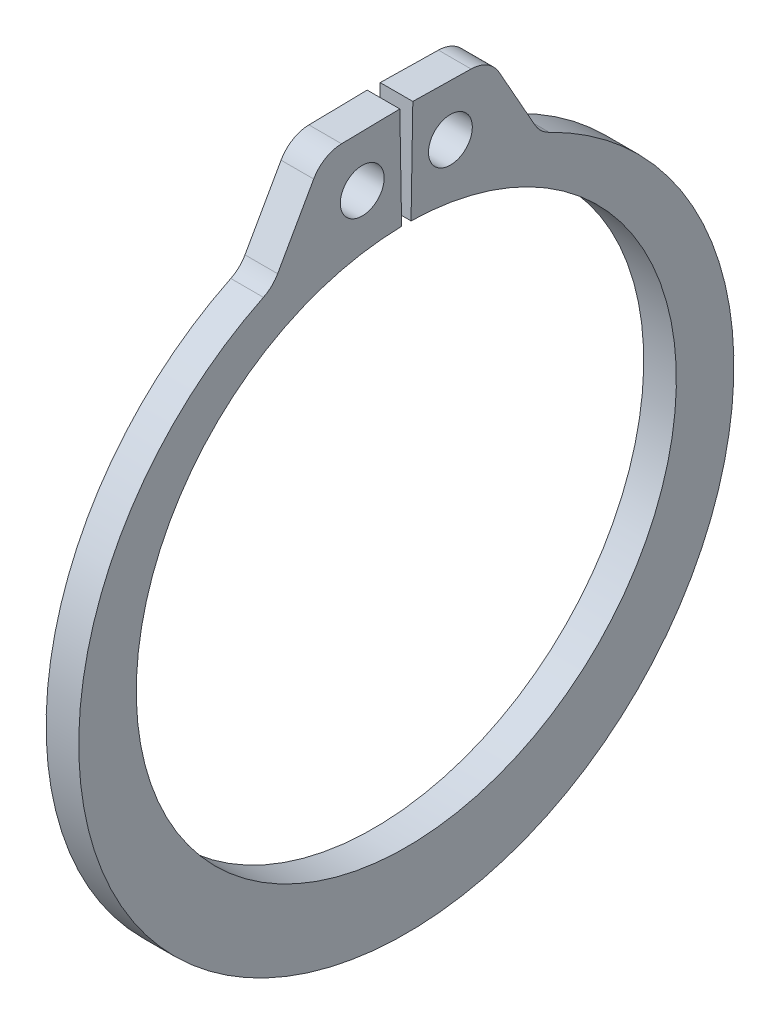
ISO-10303-21;
HEADER;
FILE_DESCRIPTION(('STEP AP214'),'2;1');
FILE_NAME('part.step','',(''),(''),'','','');
FILE_SCHEMA(('AUTOMOTIVE_DESIGN { 1 0 10303 214 1 1 1 1 }'));
ENDSEC;
DATA;
#1=APPLICATION_CONTEXT('core data for automotive mechanical design processes');
#2=APPLICATION_PROTOCOL_DEFINITION('international standard','automotive_design',2000,#1);
#3=PRODUCT_CONTEXT('',#1,'mechanical');
#4=PRODUCT('Part','Part','',(#3));
#5=PRODUCT_RELATED_PRODUCT_CATEGORY('part','',(#4));
#6=PRODUCT_DEFINITION_FORMATION('','',#4);
#7=PRODUCT_DEFINITION_CONTEXT('part definition',#1,'design');
#8=PRODUCT_DEFINITION('design','',#6,#7);
#9=PRODUCT_DEFINITION_SHAPE('','',#8);
#10=(LENGTH_UNIT() NAMED_UNIT(*) SI_UNIT(.MILLI.,.METRE.));
#11=(NAMED_UNIT(*) PLANE_ANGLE_UNIT() SI_UNIT($,.RADIAN.));
#12=(NAMED_UNIT(*) SI_UNIT($,.STERADIAN.) SOLID_ANGLE_UNIT());
#13=UNCERTAINTY_MEASURE_WITH_UNIT(LENGTH_MEASURE(1.E-05),#10,'distance_accuracy_value','');
#14=(GEOMETRIC_REPRESENTATION_CONTEXT(3) GLOBAL_UNCERTAINTY_ASSIGNED_CONTEXT((#13)) GLOBAL_UNIT_ASSIGNED_CONTEXT((#10,
#11,#12)) REPRESENTATION_CONTEXT('',''));
#15=CARTESIAN_POINT('',(0.,0.,0.));
#16=DIRECTION('',(0.,0.,1.));
#17=DIRECTION('',(1.,0.,0.));
#18=AXIS2_PLACEMENT_3D('',#15,#16,#17);
#19=CARTESIAN_POINT('',(0.4445,0.,0.));
#20=DIRECTION('',(1.,0.,0.));
#21=DIRECTION('',(0.,0.,-1.));
#22=AXIS2_PLACEMENT_3D('',#19,#20,#21);
#23=PLANE('',#22);
#24=CARTESIAN_POINT('',(0.4445,8.7306815280823,1.20030421464827));
#25=DIRECTION('',(1.,0.,0.));
#26=DIRECTION('',(0.,0.,-1.));
#27=AXIS2_PLACEMENT_3D('',#24,#25,#26);
#28=CIRCLE('',#27,0.5969);
#29=CARTESIAN_POINT('',(0.4445,8.7306815280823,0.603404214648272));
#30=VERTEX_POINT('',#29);
#31=EDGE_CURVE('E221',#30,#30,#28,.T.);
#32=ORIENTED_EDGE('',*,*,#31,.F.);
#33=EDGE_LOOP('',(#32));
#34=FACE_BOUND('',#33,.T.);
#35=DIRECTION('',(0.,-0.0174524064372845,0.999847695156391));
#36=VECTOR('',#35,1.);
#37=CARTESIAN_POINT('',(0.4445,10.1457545170604,0.177094803841047));
#38=LINE('',#37,#36);
#39=CARTESIAN_POINT('',(0.4445,10.1457545170604,0.177094803841047));
#40=VERTEX_POINT('',#39);
#41=CARTESIAN_POINT('',(0.4445,10.1180676789492,1.7632726969091));
#42=VERTEX_POINT('',#41);
#43=EDGE_CURVE('E133',#40,#42,#38,.T.);
#44=ORIENTED_EDGE('',*,*,#43,.T.);
#45=CARTESIAN_POINT('',(0.4445,9.22920307795521,1.74775750758636));
#46=DIRECTION('',(1.,0.,0.));
#47=DIRECTION('',(0.,0.,-1.));
#48=AXIS2_PLACEMENT_3D('',#45,#46,#47);
#49=CIRCLE('',#48,0.889);
#50=CARTESIAN_POINT('',(0.4445,9.66568817142324,2.52222620493971));
#51=VERTEX_POINT('',#50);
#52=EDGE_CURVE('E174',#42,#51,#49,.T.);
#53=ORIENTED_EDGE('',*,*,#52,.T.);
#54=DIRECTION('',(0.,-0.871168388473966,0.490984357106898));
#55=VECTOR('',#54,1.);
#56=CARTESIAN_POINT('',(0.4445,10.1091829993711,2.27227564904126));
#57=LINE('',#56,#55);
#58=CARTESIAN_POINT('',(0.4445,7.92368765824687,3.50400540326441));
#59=VERTEX_POINT('',#58);
#60=EDGE_CURVE('E213',#51,#59,#57,.T.);
#61=ORIENTED_EDGE('',*,*,#60,.T.);
#62=CARTESIAN_POINT('',(0.4445,8.3601727517149,4.27847410061776));
#63=DIRECTION('',(1.,0.,0.));
#64=DIRECTION('',(0.,0.,-1.));
#65=AXIS2_PLACEMENT_3D('',#62,#63,#64);
#66=CIRCLE('',#65,0.889);
#67=CARTESIAN_POINT('',(0.4445,7.5602084300375,3.8906879687832));
#68=VERTEX_POINT('',#67);
#69=EDGE_CURVE('E181',#59,#68,#66,.F.);
#70=ORIENTED_EDGE('',*,*,#69,.T.);
#71=CARTESIAN_POINT('',(0.4445,-0.465894894188214,0.));
#72=DIRECTION('',(1.,0.,0.));
#73=DIRECTION('',(0.,0.,-1.));
#74=AXIS2_PLACEMENT_3D('',#71,#72,#73);
#75=CIRCLE('',#74,8.91940510581179);
#76=CARTESIAN_POINT('',(0.4445,7.5602084300375,-3.8906879687832));
#77=VERTEX_POINT('',#76);
#78=EDGE_CURVE('E206',#68,#77,#75,.T.);
#79=ORIENTED_EDGE('',*,*,#78,.T.);
#80=CARTESIAN_POINT('',(0.4445,8.3601727517149,-4.27847410061776));
#81=DIRECTION('',(1.,0.,0.));
#82=DIRECTION('',(0.,0.,-1.));
#83=AXIS2_PLACEMENT_3D('',#80,#81,#82);
#84=CIRCLE('',#83,0.889);
#85=CARTESIAN_POINT('',(0.4445,7.92368765824687,-3.50400540326441));
#86=VERTEX_POINT('',#85);
#87=EDGE_CURVE('E11',#77,#86,#84,.F.);
#88=ORIENTED_EDGE('',*,*,#87,.T.);
#89=DIRECTION('',(0.,0.871168388473966,0.490984357106898));
#90=VECTOR('',#89,1.);
#91=CARTESIAN_POINT('',(0.4445,10.1091829993711,-2.27227564904126));
#92=LINE('',#91,#90);
#93=CARTESIAN_POINT('',(0.4445,9.66568817142324,-2.52222620493971));
#94=VERTEX_POINT('',#93);
#95=EDGE_CURVE('E205',#86,#94,#92,.T.);
#96=ORIENTED_EDGE('',*,*,#95,.T.);
#97=CARTESIAN_POINT('',(0.4445,9.22920307795521,-1.74775750758636));
#98=DIRECTION('',(1.,0.,0.));
#99=DIRECTION('',(0.,0.,-1.));
#100=AXIS2_PLACEMENT_3D('',#97,#98,#99);
#101=CIRCLE('',#100,0.889);
#102=CARTESIAN_POINT('',(0.4445,10.1180676789492,-1.7632726969091));
#103=VERTEX_POINT('',#102);
#104=EDGE_CURVE('E49',#94,#103,#101,.T.);
#105=ORIENTED_EDGE('',*,*,#104,.T.);
#106=DIRECTION('',(0.,0.0174524064372845,0.999847695156391));
#107=VECTOR('',#106,1.);
#108=CARTESIAN_POINT('',(0.4445,10.1457545170604,-0.177094803841047));
#109=LINE('',#108,#107);
#110=CARTESIAN_POINT('',(0.4445,10.1457545170604,-0.177094803841047));
#111=VERTEX_POINT('',#110);
#112=EDGE_CURVE('E210',#103,#111,#109,.T.);
#113=ORIENTED_EDGE('',*,*,#112,.T.);
#114=DIRECTION('',(0.,-0.999847695156391,0.0174524064372835));
#115=VECTOR('',#114,1.);
#116=CARTESIAN_POINT('',(0.4445,7.35218005679349,-0.128332780255277));
#117=LINE('',#116,#115);
#118=CARTESIAN_POINT('',(0.4445,7.35218005679349,-0.128332780255277));
#119=VERTEX_POINT('',#118);
#120=EDGE_CURVE('E139',#111,#119,#117,.T.);
#121=ORIENTED_EDGE('',*,*,#120,.T.);
#122=CARTESIAN_POINT('',(0.4445,0.,0.));
#123=DIRECTION('',(-1.,0.,0.));
#124=DIRECTION('',(0.,0.,-1.));
#125=AXIS2_PLACEMENT_3D('',#122,#123,#124);
#126=CIRCLE('',#125,7.3533);
#127=CARTESIAN_POINT('',(0.4445,7.35218005679349,0.128332780255277));
#128=VERTEX_POINT('',#127);
#129=EDGE_CURVE('E134',#119,#128,#126,.T.);
#130=ORIENTED_EDGE('',*,*,#129,.T.);
#131=DIRECTION('',(0.,0.999847695156391,0.0174524064372835));
#132=VECTOR('',#131,1.);
#133=CARTESIAN_POINT('',(0.4445,7.35218005679349,0.128332780255277));
#134=LINE('',#133,#132);
#135=EDGE_CURVE('E125',#128,#40,#134,.T.);
#136=ORIENTED_EDGE('',*,*,#135,.T.);
#137=EDGE_LOOP('',(#44,#53,#61,#70,#79,#88,#96,#105,#113,#121,#130,#136));
#138=FACE_BOUND('',#137,.T.);
#139=CARTESIAN_POINT('',(0.4445,8.7306815280823,-1.20030421464827));
#140=DIRECTION('',(1.,0.,0.));
#141=DIRECTION('',(0.,0.,-1.));
#142=AXIS2_PLACEMENT_3D('',#139,#140,#141);
#143=CIRCLE('',#142,0.5969);
#144=CARTESIAN_POINT('',(0.4445,8.7306815280823,-1.79720421464827));
#145=VERTEX_POINT('',#144);
#146=EDGE_CURVE('E247',#145,#145,#143,.T.);
#147=ORIENTED_EDGE('',*,*,#146,.F.);
#148=EDGE_LOOP('',(#147));
#149=FACE_BOUND('',#148,.T.);
#150=ADVANCED_FACE('F34',(#34,#138,#149),#23,.T.);
#151=CARTESIAN_POINT('',(-0.4445,0.,0.));
#152=DIRECTION('',(1.,0.,0.));
#153=DIRECTION('',(0.,0.,-1.));
#154=AXIS2_PLACEMENT_3D('',#151,#152,#153);
#155=PLANE('',#154);
#156=CARTESIAN_POINT('',(-0.4445,8.7306815280823,1.20030421464827));
#157=DIRECTION('',(1.,0.,0.));
#158=DIRECTION('',(0.,0.,-1.));
#159=AXIS2_PLACEMENT_3D('',#156,#157,#158);
#160=CIRCLE('',#159,0.5969);
#161=CARTESIAN_POINT('',(-0.4445,8.7306815280823,0.603404214648272));
#162=VERTEX_POINT('',#161);
#163=EDGE_CURVE('E244',#162,#162,#160,.T.);
#164=ORIENTED_EDGE('',*,*,#163,.T.);
#165=EDGE_LOOP('',(#164));
#166=FACE_BOUND('',#165,.T.);
#167=DIRECTION('',(0.,-0.871168388473966,0.490984357106898));
#168=VECTOR('',#167,1.);
#169=CARTESIAN_POINT('',(-0.4445,10.1091829993711,2.27227564904126));
#170=LINE('',#169,#168);
#171=CARTESIAN_POINT('',(-0.4445,9.66568817142324,2.52222620493971));
#172=VERTEX_POINT('',#171);
#173=CARTESIAN_POINT('',(-0.4445,7.92368765824687,3.50400540326441));
#174=VERTEX_POINT('',#173);
#175=EDGE_CURVE('E200',#172,#174,#170,.T.);
#176=ORIENTED_EDGE('',*,*,#175,.F.);
#177=CARTESIAN_POINT('',(-0.4445,9.22920307795521,1.74775750758636));
#178=DIRECTION('',(1.,0.,0.));
#179=DIRECTION('',(0.,0.,-1.));
#180=AXIS2_PLACEMENT_3D('',#177,#178,#179);
#181=CIRCLE('',#180,0.889);
#182=CARTESIAN_POINT('',(-0.4445,10.1180676789492,1.7632726969091));
#183=VERTEX_POINT('',#182);
#184=EDGE_CURVE('E170',#172,#183,#181,.F.);
#185=ORIENTED_EDGE('',*,*,#184,.T.);
#186=DIRECTION('',(0.,-0.0174524064372845,0.999847695156391));
#187=VECTOR('',#186,1.);
#188=CARTESIAN_POINT('',(-0.4445,10.1457545170604,0.177094803841047));
#189=LINE('',#188,#187);
#190=CARTESIAN_POINT('',(-0.4445,10.1457545170604,0.177094803841047));
#191=VERTEX_POINT('',#190);
#192=EDGE_CURVE('E223',#191,#183,#189,.T.);
#193=ORIENTED_EDGE('',*,*,#192,.F.);
#194=DIRECTION('',(0.,0.999847695156391,0.0174524064372835));
#195=VECTOR('',#194,1.);
#196=CARTESIAN_POINT('',(-0.4445,7.35218005679349,0.128332780255277));
#197=LINE('',#196,#195);
#198=CARTESIAN_POINT('',(-0.4445,7.35218005679349,0.128332780255277));
#199=VERTEX_POINT('',#198);
#200=EDGE_CURVE('E220',#199,#191,#197,.T.);
#201=ORIENTED_EDGE('',*,*,#200,.F.);
#202=CARTESIAN_POINT('',(-0.4445,0.,0.));
#203=DIRECTION('',(-1.,0.,0.));
#204=DIRECTION('',(0.,0.,-1.));
#205=AXIS2_PLACEMENT_3D('',#202,#203,#204);
#206=CIRCLE('',#205,7.3533);
#207=CARTESIAN_POINT('',(-0.4445,7.35218005679349,-0.128332780255277));
#208=VERTEX_POINT('',#207);
#209=EDGE_CURVE('E147',#208,#199,#206,.T.);
#210=ORIENTED_EDGE('',*,*,#209,.F.);
#211=DIRECTION('',(0.,-0.999847695156391,0.0174524064372835));
#212=VECTOR('',#211,1.);
#213=CARTESIAN_POINT('',(-0.4445,7.35218005679349,-0.128332780255277));
#214=LINE('',#213,#212);
#215=CARTESIAN_POINT('',(-0.4445,10.1457545170604,-0.177094803841047));
#216=VERTEX_POINT('',#215);
#217=EDGE_CURVE('E143',#216,#208,#214,.T.);
#218=ORIENTED_EDGE('',*,*,#217,.F.);
#219=DIRECTION('',(0.,0.0174524064372845,0.999847695156391));
#220=VECTOR('',#219,1.);
#221=CARTESIAN_POINT('',(-0.4445,10.1457545170604,-0.177094803841047));
#222=LINE('',#221,#220);
#223=CARTESIAN_POINT('',(-0.4445,10.1180676789492,-1.7632726969091));
#224=VERTEX_POINT('',#223);
#225=EDGE_CURVE('E228',#224,#216,#222,.T.);
#226=ORIENTED_EDGE('',*,*,#225,.F.);
#227=CARTESIAN_POINT('',(-0.4445,9.22920307795521,-1.74775750758636));
#228=DIRECTION('',(1.,0.,0.));
#229=DIRECTION('',(0.,0.,-1.));
#230=AXIS2_PLACEMENT_3D('',#227,#228,#229);
#231=CIRCLE('',#230,0.889);
#232=CARTESIAN_POINT('',(-0.4445,9.66568817142324,-2.52222620493971));
#233=VERTEX_POINT('',#232);
#234=EDGE_CURVE('E168',#224,#233,#231,.F.);
#235=ORIENTED_EDGE('',*,*,#234,.T.);
#236=DIRECTION('',(0.,0.871168388473966,0.490984357106898));
#237=VECTOR('',#236,1.);
#238=CARTESIAN_POINT('',(-0.4445,10.1091829993711,-2.27227564904126));
#239=LINE('',#238,#237);
#240=CARTESIAN_POINT('',(-0.4445,7.92368765824687,-3.50400540326441));
#241=VERTEX_POINT('',#240);
#242=EDGE_CURVE('E191',#241,#233,#239,.T.);
#243=ORIENTED_EDGE('',*,*,#242,.F.);
#244=CARTESIAN_POINT('',(-0.4445,8.3601727517149,-4.27847410061776));
#245=DIRECTION('',(1.,0.,0.));
#246=DIRECTION('',(0.,0.,-1.));
#247=AXIS2_PLACEMENT_3D('',#244,#245,#246);
#248=CIRCLE('',#247,0.889);
#249=CARTESIAN_POINT('',(-0.4445,7.5602084300375,-3.8906879687832));
#250=VERTEX_POINT('',#249);
#251=EDGE_CURVE('E42',#241,#250,#248,.T.);
#252=ORIENTED_EDGE('',*,*,#251,.T.);
#253=CARTESIAN_POINT('',(-0.4445,-0.465894894188214,0.));
#254=DIRECTION('',(1.,0.,0.));
#255=DIRECTION('',(0.,0.,-1.));
#256=AXIS2_PLACEMENT_3D('',#253,#254,#255);
#257=CIRCLE('',#256,8.91940510581179);
#258=CARTESIAN_POINT('',(-0.4445,7.5602084300375,3.8906879687832));
#259=VERTEX_POINT('',#258);
#260=EDGE_CURVE('E189',#259,#250,#257,.T.);
#261=ORIENTED_EDGE('',*,*,#260,.F.);
#262=CARTESIAN_POINT('',(-0.4445,8.3601727517149,4.27847410061776));
#263=DIRECTION('',(1.,0.,0.));
#264=DIRECTION('',(0.,0.,-1.));
#265=AXIS2_PLACEMENT_3D('',#262,#263,#264);
#266=CIRCLE('',#265,0.889);
#267=EDGE_CURVE('E179',#259,#174,#266,.T.);
#268=ORIENTED_EDGE('',*,*,#267,.T.);
#269=EDGE_LOOP('',(#176,#185,#193,#201,#210,#218,#226,#235,#243,#252,#261,#268));
#270=FACE_BOUND('',#269,.T.);
#271=CARTESIAN_POINT('',(-0.4445,8.7306815280823,-1.20030421464827));
#272=DIRECTION('',(1.,0.,0.));
#273=DIRECTION('',(0.,0.,-1.));
#274=AXIS2_PLACEMENT_3D('',#271,#272,#273);
#275=CIRCLE('',#274,0.5969);
#276=CARTESIAN_POINT('',(-0.4445,8.7306815280823,-1.79720421464827));
#277=VERTEX_POINT('',#276);
#278=EDGE_CURVE('E250',#277,#277,#275,.T.);
#279=ORIENTED_EDGE('',*,*,#278,.T.);
#280=EDGE_LOOP('',(#279));
#281=FACE_BOUND('',#280,.T.);
#282=ADVANCED_FACE('F187',(#166,#270,#281),#155,.F.);
#283=CARTESIAN_POINT('',(0.4445,0.,0.));
#284=DIRECTION('',(-1.,0.,0.));
#285=DIRECTION('',(0.,0.,1.));
#286=AXIS2_PLACEMENT_3D('',#283,#284,#285);
#287=CYLINDRICAL_SURFACE('',#286,7.3533);
#288=ORIENTED_EDGE('',*,*,#209,.T.);
#289=DIRECTION('',(-1.,0.,0.));
#290=VECTOR('',#289,1.);
#291=CARTESIAN_POINT('',(0.4445,7.35218005679349,0.128332780255277));
#292=LINE('',#291,#290);
#293=EDGE_CURVE('E129',#128,#199,#292,.T.);
#294=ORIENTED_EDGE('',*,*,#293,.F.);
#295=ORIENTED_EDGE('',*,*,#129,.F.);
#296=DIRECTION('',(-1.,0.,0.));
#297=VECTOR('',#296,1.);
#298=CARTESIAN_POINT('',(0.4445,7.35218005679349,-0.128332780255277));
#299=LINE('',#298,#297);
#300=EDGE_CURVE('E218',#119,#208,#299,.T.);
#301=ORIENTED_EDGE('',*,*,#300,.T.);
#302=EDGE_LOOP('',(#288,#294,#295,#301));
#303=FACE_BOUND('',#302,.T.);
#304=ADVANCED_FACE('F145',(#303),#287,.F.);
#305=CARTESIAN_POINT('',(0.4445,7.35218005679349,0.128332780255277));
#306=DIRECTION('',(0.,-0.0174524064372835,0.999847695156391));
#307=DIRECTION('',(0.,-0.999847695156391,-0.0174524064372835));
#308=AXIS2_PLACEMENT_3D('',#305,#306,#307);
#309=PLANE('',#308);
#310=ORIENTED_EDGE('',*,*,#200,.T.);
#311=DIRECTION('',(-1.,0.,0.));
#312=VECTOR('',#311,1.);
#313=CARTESIAN_POINT('',(0.4445,10.1457545170604,0.177094803841047));
#314=LINE('',#313,#312);
#315=EDGE_CURVE('E132',#40,#191,#314,.T.);
#316=ORIENTED_EDGE('',*,*,#315,.F.);
#317=ORIENTED_EDGE('',*,*,#135,.F.);
#318=ORIENTED_EDGE('',*,*,#293,.T.);
#319=EDGE_LOOP('',(#310,#316,#317,#318));
#320=FACE_BOUND('',#319,.T.);
#321=ADVANCED_FACE('F127',(#320),#309,.F.);
#322=CARTESIAN_POINT('',(0.4445,10.1457545170604,0.177094803841047));
#323=DIRECTION('',(0.,-0.999847695156391,-0.0174524064372845));
#324=DIRECTION('',(0.,0.0174524064372846,-0.999847695156391));
#325=AXIS2_PLACEMENT_3D('',#322,#323,#324);
#326=PLANE('',#325);
#327=ORIENTED_EDGE('',*,*,#192,.T.);
#328=DIRECTION('',(-1.,0.,0.));
#329=VECTOR('',#328,1.);
#330=CARTESIAN_POINT('',(0.4445,10.1180676789492,1.7632726969091));
#331=LINE('',#330,#329);
#332=EDGE_CURVE('E57',#183,#42,#331,.F.);
#333=ORIENTED_EDGE('',*,*,#332,.T.);
#334=ORIENTED_EDGE('',*,*,#43,.F.);
#335=ORIENTED_EDGE('',*,*,#315,.T.);
#336=EDGE_LOOP('',(#327,#333,#334,#335));
#337=FACE_BOUND('',#336,.T.);
#338=ADVANCED_FACE('F239',(#337),#326,.F.);
#339=CARTESIAN_POINT('',(0.4445,10.1091829993711,2.27227564904126));
#340=DIRECTION('',(0.,-0.490984357106898,-0.871168388473965));
#341=DIRECTION('',(0.,0.871168388473965,-0.490984357106898));
#342=AXIS2_PLACEMENT_3D('',#339,#340,#341);
#343=PLANE('',#342);
#344=ORIENTED_EDGE('',*,*,#175,.T.);
#345=DIRECTION('',(1.,0.,0.));
#346=VECTOR('',#345,1.);
#347=CARTESIAN_POINT('',(0.4445,7.92368765824687,3.50400540326441));
#348=LINE('',#347,#346);
#349=EDGE_CURVE('E161',#174,#59,#348,.T.);
#350=ORIENTED_EDGE('',*,*,#349,.T.);
#351=ORIENTED_EDGE('',*,*,#60,.F.);
#352=DIRECTION('',(-1.,0.,0.));
#353=VECTOR('',#352,1.);
#354=CARTESIAN_POINT('',(0.4445,9.66568817142324,2.52222620493971));
#355=LINE('',#354,#353);
#356=EDGE_CURVE('E158',#51,#172,#355,.T.);
#357=ORIENTED_EDGE('',*,*,#356,.T.);
#358=EDGE_LOOP('',(#344,#350,#351,#357));
#359=FACE_BOUND('',#358,.T.);
#360=ADVANCED_FACE('F280',(#359),#343,.F.);
#361=CARTESIAN_POINT('',(0.4445,-0.465894894188214,0.));
#362=DIRECTION('',(-1.,0.,0.));
#363=DIRECTION('',(0.,0.,1.));
#364=AXIS2_PLACEMENT_3D('',#361,#362,#363);
#365=CYLINDRICAL_SURFACE('',#364,8.91940510581179);
#366=ORIENTED_EDGE('',*,*,#78,.F.);
#367=DIRECTION('',(-1.,0.,0.));
#368=VECTOR('',#367,1.);
#369=CARTESIAN_POINT('',(0.4445,7.5602084300375,3.8906879687832));
#370=LINE('',#369,#368);
#371=EDGE_CURVE('E150',#68,#259,#370,.T.);
#372=ORIENTED_EDGE('',*,*,#371,.T.);
#373=ORIENTED_EDGE('',*,*,#260,.T.);
#374=DIRECTION('',(-1.,0.,0.));
#375=VECTOR('',#374,1.);
#376=CARTESIAN_POINT('',(0.4445,7.5602084300375,-3.8906879687832));
#377=LINE('',#376,#375);
#378=EDGE_CURVE('E148',#250,#77,#377,.F.);
#379=ORIENTED_EDGE('',*,*,#378,.T.);
#380=EDGE_LOOP('',(#366,#372,#373,#379));
#381=FACE_BOUND('',#380,.T.);
#382=ADVANCED_FACE('F197',(#381),#365,.T.);
#383=CARTESIAN_POINT('',(0.4445,10.1091829993711,-2.27227564904126));
#384=DIRECTION('',(0.,-0.490984357106898,0.871168388473965));
#385=DIRECTION('',(0.,-0.871168388473965,-0.490984357106898));
#386=AXIS2_PLACEMENT_3D('',#383,#384,#385);
#387=PLANE('',#386);
#388=ORIENTED_EDGE('',*,*,#95,.F.);
#389=DIRECTION('',(1.,0.,0.));
#390=VECTOR('',#389,1.);
#391=CARTESIAN_POINT('',(-0.4445,7.92368765824687,-3.50400540326441));
#392=LINE('',#391,#390);
#393=EDGE_CURVE('E165',#86,#241,#392,.F.);
#394=ORIENTED_EDGE('',*,*,#393,.T.);
#395=ORIENTED_EDGE('',*,*,#242,.T.);
#396=DIRECTION('',(-1.,0.,0.));
#397=VECTOR('',#396,1.);
#398=CARTESIAN_POINT('',(0.4445,9.66568817142324,-2.52222620493971));
#399=LINE('',#398,#397);
#400=EDGE_CURVE('E163',#233,#94,#399,.F.);
#401=ORIENTED_EDGE('',*,*,#400,.T.);
#402=EDGE_LOOP('',(#388,#394,#395,#401));
#403=FACE_BOUND('',#402,.T.);
#404=ADVANCED_FACE('F208',(#403),#387,.F.);
#405=CARTESIAN_POINT('',(0.4445,10.1457545170604,-0.177094803841047));
#406=DIRECTION('',(0.,-0.999847695156391,0.0174524064372845));
#407=DIRECTION('',(0.,-0.0174524064372846,-0.999847695156391));
#408=AXIS2_PLACEMENT_3D('',#405,#406,#407);
#409=PLANE('',#408);
#410=ORIENTED_EDGE('',*,*,#112,.F.);
#411=DIRECTION('',(-1.,0.,0.));
#412=VECTOR('',#411,1.);
#413=CARTESIAN_POINT('',(0.4445,10.1180676789492,-1.7632726969091));
#414=LINE('',#413,#412);
#415=EDGE_CURVE('E176',#103,#224,#414,.T.);
#416=ORIENTED_EDGE('',*,*,#415,.T.);
#417=ORIENTED_EDGE('',*,*,#225,.T.);
#418=DIRECTION('',(-1.,0.,0.));
#419=VECTOR('',#418,1.);
#420=CARTESIAN_POINT('',(0.4445,10.1457545170604,-0.177094803841047));
#421=LINE('',#420,#419);
#422=EDGE_CURVE('E152',#111,#216,#421,.T.);
#423=ORIENTED_EDGE('',*,*,#422,.F.);
#424=EDGE_LOOP('',(#410,#416,#417,#423));
#425=FACE_BOUND('',#424,.T.);
#426=ADVANCED_FACE('F273',(#425),#409,.F.);
#427=CARTESIAN_POINT('',(0.4445,7.35218005679349,-0.128332780255277));
#428=DIRECTION('',(0.,-0.0174524064372835,-0.999847695156391));
#429=DIRECTION('',(0.,0.999847695156391,-0.0174524064372835));
#430=AXIS2_PLACEMENT_3D('',#427,#428,#429);
#431=PLANE('',#430);
#432=ORIENTED_EDGE('',*,*,#217,.T.);
#433=ORIENTED_EDGE('',*,*,#300,.F.);
#434=ORIENTED_EDGE('',*,*,#120,.F.);
#435=ORIENTED_EDGE('',*,*,#422,.T.);
#436=EDGE_LOOP('',(#432,#433,#434,#435));
#437=FACE_BOUND('',#436,.T.);
#438=ADVANCED_FACE('F235',(#437),#431,.F.);
#439=CARTESIAN_POINT('',(0.4445,8.7306815280823,1.20030421464827));
#440=DIRECTION('',(-1.,0.,0.));
#441=DIRECTION('',(0.,0.,1.));
#442=AXIS2_PLACEMENT_3D('',#439,#440,#441);
#443=CYLINDRICAL_SURFACE('',#442,0.5969);
#444=ORIENTED_EDGE('',*,*,#31,.T.);
#445=EDGE_LOOP('',(#444));
#446=FACE_BOUND('',#445,.T.);
#447=ORIENTED_EDGE('',*,*,#163,.F.);
#448=EDGE_LOOP('',(#447));
#449=FACE_BOUND('',#448,.T.);
#450=ADVANCED_FACE('F268',(#446,#449),#443,.F.);
#451=CARTESIAN_POINT('',(0.4445,8.7306815280823,-1.20030421464827));
#452=DIRECTION('',(-1.,0.,0.));
#453=DIRECTION('',(0.,0.,1.));
#454=AXIS2_PLACEMENT_3D('',#451,#452,#453);
#455=CYLINDRICAL_SURFACE('',#454,0.5969);
#456=ORIENTED_EDGE('',*,*,#146,.T.);
#457=EDGE_LOOP('',(#456));
#458=FACE_BOUND('',#457,.T.);
#459=ORIENTED_EDGE('',*,*,#278,.F.);
#460=EDGE_LOOP('',(#459));
#461=FACE_BOUND('',#460,.T.);
#462=ADVANCED_FACE('F256',(#458,#461),#455,.F.);
#463=CARTESIAN_POINT('',(0.4445,8.3601727517149,4.27847410061776));
#464=DIRECTION('',(-1.,0.,0.));
#465=DIRECTION('',(0.,0.,1.));
#466=AXIS2_PLACEMENT_3D('',#463,#464,#465);
#467=CYLINDRICAL_SURFACE('',#466,0.889);
#468=ORIENTED_EDGE('',*,*,#69,.F.);
#469=ORIENTED_EDGE('',*,*,#349,.F.);
#470=ORIENTED_EDGE('',*,*,#267,.F.);
#471=ORIENTED_EDGE('',*,*,#371,.F.);
#472=EDGE_LOOP('',(#468,#469,#470,#471));
#473=FACE_BOUND('',#472,.T.);
#474=ADVANCED_FACE('F290',(#473),#467,.F.);
#475=CARTESIAN_POINT('',(0.4445,8.3601727517149,-4.27847410061776));
#476=DIRECTION('',(-1.,0.,0.));
#477=DIRECTION('',(0.,0.,1.));
#478=AXIS2_PLACEMENT_3D('',#475,#476,#477);
#479=CYLINDRICAL_SURFACE('',#478,0.889);
#480=ORIENTED_EDGE('',*,*,#87,.F.);
#481=ORIENTED_EDGE('',*,*,#378,.F.);
#482=ORIENTED_EDGE('',*,*,#251,.F.);
#483=ORIENTED_EDGE('',*,*,#393,.F.);
#484=EDGE_LOOP('',(#480,#481,#482,#483));
#485=FACE_BOUND('',#484,.T.);
#486=ADVANCED_FACE('F203',(#485),#479,.F.);
#487=CARTESIAN_POINT('',(0.4445,9.22920307795521,1.74775750758636));
#488=DIRECTION('',(-1.,0.,0.));
#489=DIRECTION('',(0.,0.,1.));
#490=AXIS2_PLACEMENT_3D('',#487,#488,#489);
#491=CYLINDRICAL_SURFACE('',#490,0.889);
#492=ORIENTED_EDGE('',*,*,#52,.F.);
#493=ORIENTED_EDGE('',*,*,#332,.F.);
#494=ORIENTED_EDGE('',*,*,#184,.F.);
#495=ORIENTED_EDGE('',*,*,#356,.F.);
#496=EDGE_LOOP('',(#492,#493,#494,#495));
#497=FACE_BOUND('',#496,.T.);
#498=ADVANCED_FACE('F295',(#497),#491,.T.);
#499=CARTESIAN_POINT('',(0.4445,9.22920307795521,-1.74775750758636));
#500=DIRECTION('',(-1.,0.,0.));
#501=DIRECTION('',(0.,0.,1.));
#502=AXIS2_PLACEMENT_3D('',#499,#500,#501);
#503=CYLINDRICAL_SURFACE('',#502,0.889);
#504=ORIENTED_EDGE('',*,*,#104,.F.);
#505=ORIENTED_EDGE('',*,*,#400,.F.);
#506=ORIENTED_EDGE('',*,*,#234,.F.);
#507=ORIENTED_EDGE('',*,*,#415,.F.);
#508=EDGE_LOOP('',(#504,#505,#506,#507));
#509=FACE_BOUND('',#508,.T.);
#510=ADVANCED_FACE('F36',(#509),#503,.T.);
#511=CLOSED_SHELL('',(#150,#282,#304,#321,#338,#360,#382,#404,#426,#438,#450,#462,#474,#486,
#498,#510));
#512=MANIFOLD_SOLID_BREP('B2',#511);
#513=ADVANCED_BREP_SHAPE_REPRESENTATION('',(#18,#512),#14);
#514=SHAPE_DEFINITION_REPRESENTATION(#9,#513);
ENDSEC;
END-ISO-10303-21;
